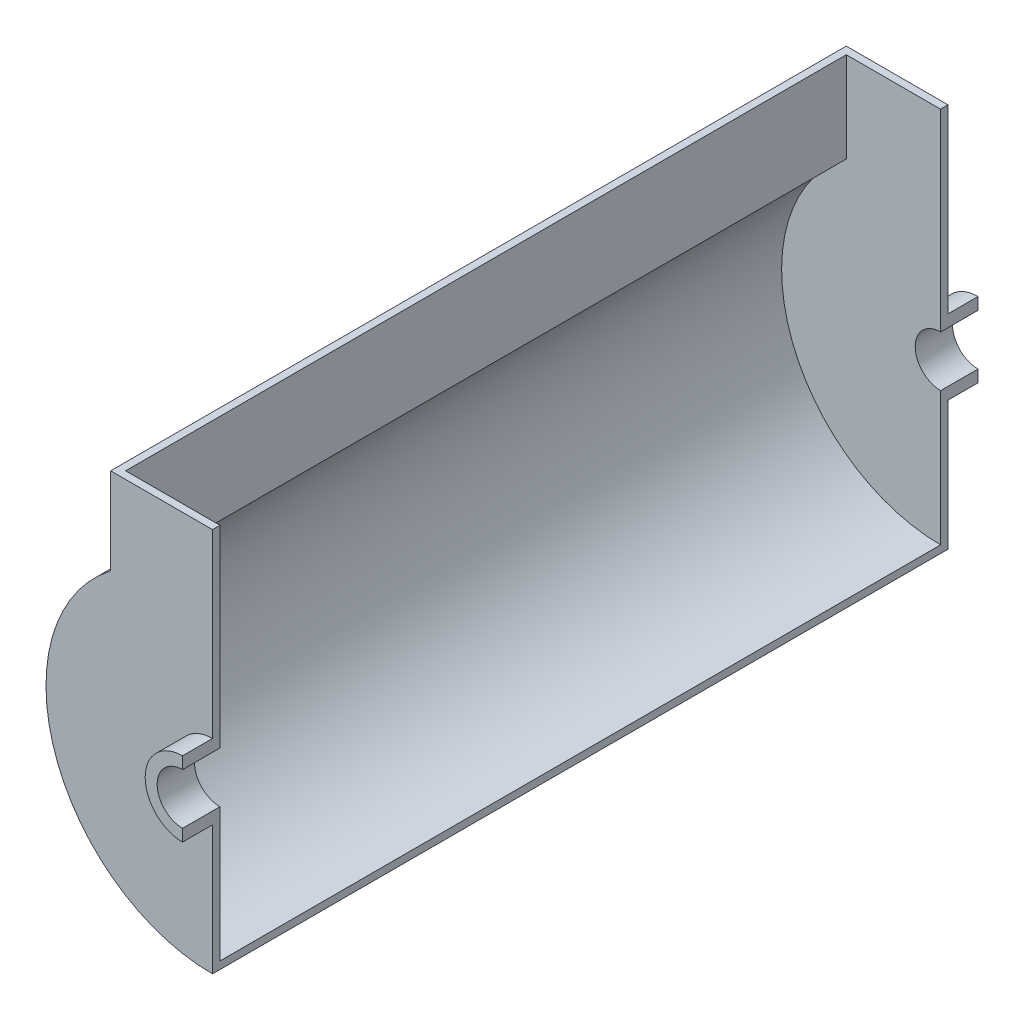
ISO-10303-21;
HEADER;
FILE_DESCRIPTION(('STEP AP214'),'2;1');
FILE_NAME('part.step','',(''),(''),'','','');
FILE_SCHEMA(('AUTOMOTIVE_DESIGN { 1 0 10303 214 1 1 1 1 }'));
ENDSEC;
DATA;
#1=APPLICATION_CONTEXT('core data for automotive mechanical design processes');
#2=APPLICATION_PROTOCOL_DEFINITION('international standard','automotive_design',2000,#1);
#3=PRODUCT_CONTEXT('',#1,'mechanical');
#4=PRODUCT('Part','Part','',(#3));
#5=PRODUCT_RELATED_PRODUCT_CATEGORY('part','',(#4));
#6=PRODUCT_DEFINITION_FORMATION('','',#4);
#7=PRODUCT_DEFINITION_CONTEXT('part definition',#1,'design');
#8=PRODUCT_DEFINITION('design','',#6,#7);
#9=PRODUCT_DEFINITION_SHAPE('','',#8);
#10=(LENGTH_UNIT() NAMED_UNIT(*) SI_UNIT(.MILLI.,.METRE.));
#11=(NAMED_UNIT(*) PLANE_ANGLE_UNIT() SI_UNIT($,.RADIAN.));
#12=(NAMED_UNIT(*) SI_UNIT($,.STERADIAN.) SOLID_ANGLE_UNIT());
#13=UNCERTAINTY_MEASURE_WITH_UNIT(LENGTH_MEASURE(1.E-05),#10,'distance_accuracy_value','');
#14=(GEOMETRIC_REPRESENTATION_CONTEXT(3) GLOBAL_UNCERTAINTY_ASSIGNED_CONTEXT((#13)) GLOBAL_UNIT_ASSIGNED_CONTEXT((#10,
#11,#12)) REPRESENTATION_CONTEXT('',''));
#15=CARTESIAN_POINT('',(0.,0.,0.));
#16=DIRECTION('',(0.,0.,1.));
#17=DIRECTION('',(1.,0.,0.));
#18=AXIS2_PLACEMENT_3D('',#15,#16,#17);
#19=CARTESIAN_POINT('',(0.,0.,-5.));
#20=DIRECTION('',(0.,0.,1.));
#21=DIRECTION('',(1.,0.,0.));
#22=AXIS2_PLACEMENT_3D('',#19,#20,#21);
#23=PLANE('',#22);
#24=CARTESIAN_POINT('',(0.,0.,-5.));
#25=DIRECTION('',(0.,0.,1.));
#26=DIRECTION('',(-1.,0.,0.));
#27=AXIS2_PLACEMENT_3D('',#24,#25,#26);
#28=CIRCLE('',#27,106.338317305831);
#29=CARTESIAN_POINT('',(-63.0935796315746,85.5981187685207,-5.));
#30=VERTEX_POINT('',#29);
#31=CARTESIAN_POINT('',(0.,-106.338317305831,-5.));
#32=VERTEX_POINT('',#31);
#33=EDGE_CURVE('E195',#30,#32,#28,.T.);
#34=ORIENTED_EDGE('',*,*,#33,.F.);
#35=DIRECTION('',(0.,-1.,0.));
#36=VECTOR('',#35,1.);
#37=CARTESIAN_POINT('',(-63.0935796315746,146.014758250682,-5.));
#38=LINE('',#37,#36);
#39=CARTESIAN_POINT('',(-63.0935796315746,146.014758250682,-5.));
#40=VERTEX_POINT('',#39);
#41=EDGE_CURVE('E52',#40,#30,#38,.T.);
#42=ORIENTED_EDGE('',*,*,#41,.F.);
#43=DIRECTION('',(-1.,0.,0.));
#44=VECTOR('',#43,1.);
#45=CARTESIAN_POINT('',(0.,146.014758250682,-5.));
#46=LINE('',#45,#44);
#47=CARTESIAN_POINT('',(0.,146.014758250682,-5.));
#48=VERTEX_POINT('',#47);
#49=EDGE_CURVE('E211',#48,#40,#46,.T.);
#50=ORIENTED_EDGE('',*,*,#49,.F.);
#51=DIRECTION('',(0.,1.,0.));
#52=VECTOR('',#51,1.);
#53=CARTESIAN_POINT('',(0.,25.,-5.));
#54=LINE('',#53,#52);
#55=CARTESIAN_POINT('',(0.,17.,-5.));
#56=VERTEX_POINT('',#55);
#57=EDGE_CURVE('E253',#56,#48,#54,.T.);
#58=ORIENTED_EDGE('',*,*,#57,.F.);
#59=CARTESIAN_POINT('',(0.,0.,-5.));
#60=DIRECTION('',(0.,0.,-1.));
#61=DIRECTION('',(1.,0.,0.));
#62=AXIS2_PLACEMENT_3D('',#59,#60,#61);
#63=CIRCLE('',#62,17.);
#64=CARTESIAN_POINT('',(0.,-17.,-5.));
#65=VERTEX_POINT('',#64);
#66=EDGE_CURVE('E250',#65,#56,#63,.T.);
#67=ORIENTED_EDGE('',*,*,#66,.F.);
#68=DIRECTION('',(0.,1.,0.));
#69=VECTOR('',#68,1.);
#70=CARTESIAN_POINT('',(0.,-17.,-5.));
#71=LINE('',#70,#69);
#72=EDGE_CURVE('E58',#32,#65,#71,.T.);
#73=ORIENTED_EDGE('',*,*,#72,.F.);
#74=EDGE_LOOP('',(#34,#42,#50,#58,#67,#73));
#75=FACE_BOUND('',#74,.T.);
#76=ADVANCED_FACE('F35',(#75),#23,.F.);
#77=CARTESIAN_POINT('',(0.,0.,-5.));
#78=DIRECTION('',(0.,0.,1.));
#79=DIRECTION('',(1.,0.,0.));
#80=AXIS2_PLACEMENT_3D('',#77,#78,#79);
#81=CYLINDRICAL_SURFACE('',#80,17.);
#82=DIRECTION('',(0.,0.,1.));
#83=VECTOR('',#82,1.);
#84=CARTESIAN_POINT('',(0.,17.,-5.));
#85=LINE('',#84,#83);
#86=CARTESIAN_POINT('',(0.,17.,20.));
#87=VERTEX_POINT('',#86);
#88=EDGE_CURVE('E39',#56,#87,#85,.T.);
#89=ORIENTED_EDGE('',*,*,#88,.T.);
#90=CARTESIAN_POINT('',(0.,0.,20.));
#91=DIRECTION('',(0.,0.,-1.));
#92=DIRECTION('',(1.,0.,0.));
#93=AXIS2_PLACEMENT_3D('',#90,#91,#92);
#94=CIRCLE('',#93,17.);
#95=CARTESIAN_POINT('',(0.,-17.,20.));
#96=VERTEX_POINT('',#95);
#97=EDGE_CURVE('E233',#96,#87,#94,.T.);
#98=ORIENTED_EDGE('',*,*,#97,.F.);
#99=DIRECTION('',(0.,0.,1.));
#100=VECTOR('',#99,1.);
#101=CARTESIAN_POINT('',(0.,-17.,-5.));
#102=LINE('',#101,#100);
#103=EDGE_CURVE('E11',#65,#96,#102,.T.);
#104=ORIENTED_EDGE('',*,*,#103,.F.);
#105=ORIENTED_EDGE('',*,*,#66,.T.);
#106=EDGE_LOOP('',(#89,#98,#104,#105));
#107=FACE_BOUND('',#106,.T.);
#108=ADVANCED_FACE('F37',(#107),#81,.F.);
#109=CARTESIAN_POINT('',(0.,-17.,-5.));
#110=DIRECTION('',(1.,0.,0.));
#111=DIRECTION('',(0.,0.,-1.));
#112=AXIS2_PLACEMENT_3D('',#109,#110,#111);
#113=PLANE('',#112);
#114=ORIENTED_EDGE('',*,*,#103,.T.);
#115=DIRECTION('',(0.,1.,0.));
#116=VECTOR('',#115,1.);
#117=CARTESIAN_POINT('',(0.,-17.,20.));
#118=LINE('',#117,#116);
#119=CARTESIAN_POINT('',(0.,-25.,20.));
#120=VERTEX_POINT('',#119);
#121=EDGE_CURVE('E247',#120,#96,#118,.T.);
#122=ORIENTED_EDGE('',*,*,#121,.F.);
#123=DIRECTION('',(0.,0.,1.));
#124=VECTOR('',#123,1.);
#125=CARTESIAN_POINT('',(0.,-25.,-5.));
#126=LINE('',#125,#124);
#127=CARTESIAN_POINT('',(0.,-25.,0.));
#128=VERTEX_POINT('',#127);
#129=EDGE_CURVE('E44',#128,#120,#126,.T.);
#130=ORIENTED_EDGE('',*,*,#129,.F.);
#131=DIRECTION('',(0.,1.,0.));
#132=VECTOR('',#131,1.);
#133=CARTESIAN_POINT('',(0.,-25.,0.));
#134=LINE('',#133,#132);
#135=CARTESIAN_POINT('',(0.,-111.338317305831,0.));
#136=VERTEX_POINT('',#135);
#137=EDGE_CURVE('E214',#136,#128,#134,.T.);
#138=ORIENTED_EDGE('',*,*,#137,.F.);
#139=DIRECTION('',(0.,0.,1.));
#140=VECTOR('',#139,1.);
#141=CARTESIAN_POINT('',(0.,-111.338317305831,-5.));
#142=LINE('',#141,#140);
#143=CARTESIAN_POINT('',(0.,-111.338317305831,-492.));
#144=VERTEX_POINT('',#143);
#145=EDGE_CURVE('E231',#144,#136,#142,.T.);
#146=ORIENTED_EDGE('',*,*,#145,.F.);
#147=DIRECTION('',(0.,1.,0.));
#148=VECTOR('',#147,1.);
#149=CARTESIAN_POINT('',(0.,-25.,-492.));
#150=LINE('',#149,#148);
#151=CARTESIAN_POINT('',(0.,-25.,-492.));
#152=VERTEX_POINT('',#151);
#153=EDGE_CURVE('E162',#144,#152,#150,.T.);
#154=ORIENTED_EDGE('',*,*,#153,.T.);
#155=DIRECTION('',(0.,0.,-1.));
#156=VECTOR('',#155,1.);
#157=CARTESIAN_POINT('',(0.,-25.,-487.));
#158=LINE('',#157,#156);
#159=CARTESIAN_POINT('',(0.,-25.,-512.));
#160=VERTEX_POINT('',#159);
#161=EDGE_CURVE('E188',#152,#160,#158,.T.);
#162=ORIENTED_EDGE('',*,*,#161,.T.);
#163=DIRECTION('',(0.,1.,0.));
#164=VECTOR('',#163,1.);
#165=CARTESIAN_POINT('',(0.,-17.,-512.));
#166=LINE('',#165,#164);
#167=CARTESIAN_POINT('',(0.,-17.,-512.));
#168=VERTEX_POINT('',#167);
#169=EDGE_CURVE('E181',#160,#168,#166,.T.);
#170=ORIENTED_EDGE('',*,*,#169,.T.);
#171=DIRECTION('',(0.,0.,-1.));
#172=VECTOR('',#171,1.);
#173=CARTESIAN_POINT('',(0.,-17.,-487.));
#174=LINE('',#173,#172);
#175=CARTESIAN_POINT('',(0.,-17.,-487.));
#176=VERTEX_POINT('',#175);
#177=EDGE_CURVE('E185',#176,#168,#174,.T.);
#178=ORIENTED_EDGE('',*,*,#177,.F.);
#179=DIRECTION('',(0.,1.,0.));
#180=VECTOR('',#179,1.);
#181=CARTESIAN_POINT('',(0.,-17.,-487.));
#182=LINE('',#181,#180);
#183=CARTESIAN_POINT('',(0.,-106.338317305831,-487.));
#184=VERTEX_POINT('',#183);
#185=EDGE_CURVE('E177',#184,#176,#182,.T.);
#186=ORIENTED_EDGE('',*,*,#185,.F.);
#187=DIRECTION('',(0.,0.,1.));
#188=VECTOR('',#187,1.);
#189=CARTESIAN_POINT('',(0.,-106.338317305831,-767.404754593944));
#190=LINE('',#189,#188);
#191=EDGE_CURVE('E198',#184,#32,#190,.T.);
#192=ORIENTED_EDGE('',*,*,#191,.T.);
#193=ORIENTED_EDGE('',*,*,#72,.T.);
#194=EDGE_LOOP('',(#114,#122,#130,#138,#146,#154,#162,#170,#178,#186,#192,#193));
#195=FACE_BOUND('',#194,.T.);
#196=ADVANCED_FACE('F271',(#195),#113,.T.);
#197=CARTESIAN_POINT('',(0.,0.,-5.));
#198=DIRECTION('',(0.,0.,1.));
#199=DIRECTION('',(1.,0.,0.));
#200=AXIS2_PLACEMENT_3D('',#197,#198,#199);
#201=CYLINDRICAL_SURFACE('',#200,25.);
#202=CARTESIAN_POINT('',(0.,0.,0.));
#203=DIRECTION('',(0.,0.,-1.));
#204=DIRECTION('',(1.,0.,0.));
#205=AXIS2_PLACEMENT_3D('',#202,#203,#204);
#206=CIRCLE('',#205,25.);
#207=CARTESIAN_POINT('',(0.,25.,0.));
#208=VERTEX_POINT('',#207);
#209=EDGE_CURVE('E204',#128,#208,#206,.T.);
#210=ORIENTED_EDGE('',*,*,#209,.F.);
#211=ORIENTED_EDGE('',*,*,#129,.T.);
#212=CARTESIAN_POINT('',(0.,0.,20.));
#213=DIRECTION('',(0.,0.,1.));
#214=DIRECTION('',(1.,0.,0.));
#215=AXIS2_PLACEMENT_3D('',#212,#213,#214);
#216=CIRCLE('',#215,25.);
#217=CARTESIAN_POINT('',(0.,25.,20.));
#218=VERTEX_POINT('',#217);
#219=EDGE_CURVE('E244',#218,#120,#216,.T.);
#220=ORIENTED_EDGE('',*,*,#219,.F.);
#221=DIRECTION('',(0.,0.,1.));
#222=VECTOR('',#221,1.);
#223=CARTESIAN_POINT('',(0.,25.,-5.));
#224=LINE('',#223,#222);
#225=EDGE_CURVE('E256',#208,#218,#224,.T.);
#226=ORIENTED_EDGE('',*,*,#225,.F.);
#227=EDGE_LOOP('',(#210,#211,#220,#226));
#228=FACE_BOUND('',#227,.T.);
#229=ADVANCED_FACE('F278',(#228),#201,.T.);
#230=CARTESIAN_POINT('',(0.,25.,-5.));
#231=DIRECTION('',(1.,0.,0.));
#232=DIRECTION('',(0.,0.,-1.));
#233=AXIS2_PLACEMENT_3D('',#230,#231,#232);
#234=PLANE('',#233);
#235=ORIENTED_EDGE('',*,*,#57,.T.);
#236=DIRECTION('',(0.,0.,1.));
#237=VECTOR('',#236,1.);
#238=CARTESIAN_POINT('',(0.,146.014758250682,-5.));
#239=LINE('',#238,#237);
#240=CARTESIAN_POINT('',(0.,146.014758250682,0.));
#241=VERTEX_POINT('',#240);
#242=EDGE_CURVE('E213',#48,#241,#239,.T.);
#243=ORIENTED_EDGE('',*,*,#242,.T.);
#244=DIRECTION('',(0.,1.,0.));
#245=VECTOR('',#244,1.);
#246=CARTESIAN_POINT('',(0.,25.,0.));
#247=LINE('',#246,#245);
#248=EDGE_CURVE('E217',#208,#241,#247,.T.);
#249=ORIENTED_EDGE('',*,*,#248,.F.);
#250=ORIENTED_EDGE('',*,*,#225,.T.);
#251=DIRECTION('',(0.,1.,0.));
#252=VECTOR('',#251,1.);
#253=CARTESIAN_POINT('',(0.,25.,20.));
#254=LINE('',#253,#252);
#255=EDGE_CURVE('E241',#87,#218,#254,.T.);
#256=ORIENTED_EDGE('',*,*,#255,.F.);
#257=ORIENTED_EDGE('',*,*,#88,.F.);
#258=EDGE_LOOP('',(#235,#243,#249,#250,#256,#257));
#259=FACE_BOUND('',#258,.T.);
#260=ADVANCED_FACE('F264',(#259),#234,.T.);
#261=CARTESIAN_POINT('',(0.,0.,20.));
#262=DIRECTION('',(0.,0.,1.));
#263=DIRECTION('',(1.,0.,0.));
#264=AXIS2_PLACEMENT_3D('',#261,#262,#263);
#265=PLANE('',#264);
#266=ORIENTED_EDGE('',*,*,#97,.T.);
#267=ORIENTED_EDGE('',*,*,#255,.T.);
#268=ORIENTED_EDGE('',*,*,#219,.T.);
#269=ORIENTED_EDGE('',*,*,#121,.T.);
#270=EDGE_LOOP('',(#266,#267,#268,#269));
#271=FACE_BOUND('',#270,.T.);
#272=ADVANCED_FACE('F267',(#271),#265,.T.);
#273=CARTESIAN_POINT('',(0.,0.,-5.));
#274=DIRECTION('',(0.,0.,1.));
#275=DIRECTION('',(1.,0.,0.));
#276=AXIS2_PLACEMENT_3D('',#273,#274,#275);
#277=CYLINDRICAL_SURFACE('',#276,111.338317305831);
#278=CARTESIAN_POINT('',(0.,0.,0.));
#279=DIRECTION('',(0.,0.,1.));
#280=DIRECTION('',(1.,0.,0.));
#281=AXIS2_PLACEMENT_3D('',#278,#279,#280);
#282=CIRCLE('',#281,111.338317305831);
#283=CARTESIAN_POINT('',(-68.0935796315746,88.08794079471,0.));
#284=VERTEX_POINT('',#283);
#285=EDGE_CURVE('E226',#284,#136,#282,.T.);
#286=ORIENTED_EDGE('',*,*,#285,.F.);
#287=DIRECTION('',(0.,0.,1.));
#288=VECTOR('',#287,1.);
#289=CARTESIAN_POINT('',(-68.0935796315746,88.08794079471,-5.));
#290=LINE('',#289,#288);
#291=CARTESIAN_POINT('',(-68.0935796315746,88.08794079471,-492.));
#292=VERTEX_POINT('',#291);
#293=EDGE_CURVE('E234',#292,#284,#290,.T.);
#294=ORIENTED_EDGE('',*,*,#293,.F.);
#295=CARTESIAN_POINT('',(0.,0.,-492.));
#296=DIRECTION('',(0.,0.,1.));
#297=DIRECTION('',(1.,0.,0.));
#298=AXIS2_PLACEMENT_3D('',#295,#296,#297);
#299=CIRCLE('',#298,111.338317305831);
#300=EDGE_CURVE('E346',#292,#144,#299,.T.);
#301=ORIENTED_EDGE('',*,*,#300,.T.);
#302=ORIENTED_EDGE('',*,*,#145,.T.);
#303=EDGE_LOOP('',(#286,#294,#301,#302));
#304=FACE_BOUND('',#303,.T.);
#305=ADVANCED_FACE('F294',(#304),#277,.T.);
#306=CARTESIAN_POINT('',(-68.0935796315746,146.014758250682,-5.));
#307=DIRECTION('',(-1.,0.,0.));
#308=DIRECTION('',(0.,0.,1.));
#309=AXIS2_PLACEMENT_3D('',#306,#307,#308);
#310=PLANE('',#309);
#311=DIRECTION('',(0.,-1.,0.));
#312=VECTOR('',#311,1.);
#313=CARTESIAN_POINT('',(-68.0935796315746,146.014758250682,0.));
#314=LINE('',#313,#312);
#315=CARTESIAN_POINT('',(-68.0935796315746,146.014758250682,0.));
#316=VERTEX_POINT('',#315);
#317=EDGE_CURVE('E223',#316,#284,#314,.T.);
#318=ORIENTED_EDGE('',*,*,#317,.F.);
#319=DIRECTION('',(0.,0.,1.));
#320=VECTOR('',#319,1.);
#321=CARTESIAN_POINT('',(-68.0935796315746,146.014758250682,-5.));
#322=LINE('',#321,#320);
#323=CARTESIAN_POINT('',(-68.0935796315746,146.014758250682,-492.));
#324=VERTEX_POINT('',#323);
#325=EDGE_CURVE('E236',#324,#316,#322,.T.);
#326=ORIENTED_EDGE('',*,*,#325,.F.);
#327=DIRECTION('',(0.,-1.,0.));
#328=VECTOR('',#327,1.);
#329=CARTESIAN_POINT('',(-68.0935796315746,146.014758250682,-492.));
#330=LINE('',#329,#328);
#331=EDGE_CURVE('E348',#324,#292,#330,.T.);
#332=ORIENTED_EDGE('',*,*,#331,.T.);
#333=ORIENTED_EDGE('',*,*,#293,.T.);
#334=EDGE_LOOP('',(#318,#326,#332,#333));
#335=FACE_BOUND('',#334,.T.);
#336=ADVANCED_FACE('F297',(#335),#310,.T.);
#337=CARTESIAN_POINT('',(0.,146.014758250682,-5.));
#338=DIRECTION('',(0.,1.,0.));
#339=DIRECTION('',(0.,0.,1.));
#340=AXIS2_PLACEMENT_3D('',#337,#338,#339);
#341=PLANE('',#340);
#342=DIRECTION('',(-1.,0.,0.));
#343=VECTOR('',#342,1.);
#344=CARTESIAN_POINT('',(0.,146.014758250682,0.));
#345=LINE('',#344,#343);
#346=EDGE_CURVE('E220',#241,#316,#345,.T.);
#347=ORIENTED_EDGE('',*,*,#346,.F.);
#348=ORIENTED_EDGE('',*,*,#242,.F.);
#349=ORIENTED_EDGE('',*,*,#49,.T.);
#350=DIRECTION('',(0.,0.,1.));
#351=VECTOR('',#350,1.);
#352=CARTESIAN_POINT('',(-63.0935796315746,146.014758250682,-767.404754593944));
#353=LINE('',#352,#351);
#354=CARTESIAN_POINT('',(-63.0935796315746,146.014758250682,-487.));
#355=VERTEX_POINT('',#354);
#356=EDGE_CURVE('E158',#355,#40,#353,.T.);
#357=ORIENTED_EDGE('',*,*,#356,.F.);
#358=DIRECTION('',(-1.,0.,0.));
#359=VECTOR('',#358,1.);
#360=CARTESIAN_POINT('',(0.,146.014758250682,-487.));
#361=LINE('',#360,#359);
#362=CARTESIAN_POINT('',(0.,146.014758250682,-487.));
#363=VERTEX_POINT('',#362);
#364=EDGE_CURVE('E150',#363,#355,#361,.T.);
#365=ORIENTED_EDGE('',*,*,#364,.F.);
#366=DIRECTION('',(0.,0.,-1.));
#367=VECTOR('',#366,1.);
#368=CARTESIAN_POINT('',(0.,146.014758250682,-487.));
#369=LINE('',#368,#367);
#370=CARTESIAN_POINT('',(0.,146.014758250682,-492.));
#371=VERTEX_POINT('',#370);
#372=EDGE_CURVE('E155',#363,#371,#369,.T.);
#373=ORIENTED_EDGE('',*,*,#372,.T.);
#374=DIRECTION('',(-1.,0.,0.));
#375=VECTOR('',#374,1.);
#376=CARTESIAN_POINT('',(0.,146.014758250682,-492.));
#377=LINE('',#376,#375);
#378=EDGE_CURVE('E362',#371,#324,#377,.T.);
#379=ORIENTED_EDGE('',*,*,#378,.T.);
#380=ORIENTED_EDGE('',*,*,#325,.T.);
#381=EDGE_LOOP('',(#347,#348,#349,#357,#365,#373,#379,#380));
#382=FACE_BOUND('',#381,.T.);
#383=ADVANCED_FACE('F153',(#382),#341,.T.);
#384=CARTESIAN_POINT('',(0.,0.,0.));
#385=DIRECTION('',(0.,0.,1.));
#386=DIRECTION('',(1.,0.,0.));
#387=AXIS2_PLACEMENT_3D('',#384,#385,#386);
#388=PLANE('',#387);
#389=ORIENTED_EDGE('',*,*,#209,.T.);
#390=ORIENTED_EDGE('',*,*,#248,.T.);
#391=ORIENTED_EDGE('',*,*,#346,.T.);
#392=ORIENTED_EDGE('',*,*,#317,.T.);
#393=ORIENTED_EDGE('',*,*,#285,.T.);
#394=ORIENTED_EDGE('',*,*,#137,.T.);
#395=EDGE_LOOP('',(#389,#390,#391,#392,#393,#394));
#396=FACE_BOUND('',#395,.T.);
#397=ADVANCED_FACE('F276',(#396),#388,.T.);
#398=CARTESIAN_POINT('',(-63.0935796315746,146.014758250682,-767.404754593944));
#399=DIRECTION('',(-1.,0.,0.));
#400=DIRECTION('',(0.,-1.,0.));
#401=AXIS2_PLACEMENT_3D('',#398,#399,#400);
#402=PLANE('',#401);
#403=DIRECTION('',(0.,-1.,0.));
#404=VECTOR('',#403,1.);
#405=CARTESIAN_POINT('',(-63.0935796315746,146.014758250682,-487.));
#406=LINE('',#405,#404);
#407=CARTESIAN_POINT('',(-63.0935796315746,85.5981187685207,-487.));
#408=VERTEX_POINT('',#407);
#409=EDGE_CURVE('E205',#355,#408,#406,.T.);
#410=ORIENTED_EDGE('',*,*,#409,.F.);
#411=ORIENTED_EDGE('',*,*,#356,.T.);
#412=ORIENTED_EDGE('',*,*,#41,.T.);
#413=DIRECTION('',(0.,0.,1.));
#414=VECTOR('',#413,1.);
#415=CARTESIAN_POINT('',(-63.0935796315746,85.5981187685207,-767.404754593944));
#416=LINE('',#415,#414);
#417=EDGE_CURVE('E199',#408,#30,#416,.T.);
#418=ORIENTED_EDGE('',*,*,#417,.F.);
#419=EDGE_LOOP('',(#410,#411,#412,#418));
#420=FACE_BOUND('',#419,.T.);
#421=ADVANCED_FACE('F306',(#420),#402,.F.);
#422=CARTESIAN_POINT('',(0.,0.,-767.404754593944));
#423=DIRECTION('',(0.,0.,1.));
#424=DIRECTION('',(1.,0.,0.));
#425=AXIS2_PLACEMENT_3D('',#422,#423,#424);
#426=CYLINDRICAL_SURFACE('',#425,106.338317305831);
#427=CARTESIAN_POINT('',(0.,0.,-487.));
#428=DIRECTION('',(0.,0.,-1.));
#429=DIRECTION('',(-1.,0.,0.));
#430=AXIS2_PLACEMENT_3D('',#427,#428,#429);
#431=CIRCLE('',#430,106.338317305831);
#432=EDGE_CURVE('E201',#408,#184,#431,.F.);
#433=ORIENTED_EDGE('',*,*,#432,.F.);
#434=ORIENTED_EDGE('',*,*,#417,.T.);
#435=ORIENTED_EDGE('',*,*,#33,.T.);
#436=ORIENTED_EDGE('',*,*,#191,.F.);
#437=EDGE_LOOP('',(#433,#434,#435,#436));
#438=FACE_BOUND('',#437,.T.);
#439=ADVANCED_FACE('F309',(#438),#426,.F.);
#440=CARTESIAN_POINT('',(0.,0.,-487.));
#441=DIRECTION('',(0.,0.,-1.));
#442=DIRECTION('',(1.,0.,0.));
#443=AXIS2_PLACEMENT_3D('',#440,#441,#442);
#444=PLANE('',#443);
#445=ORIENTED_EDGE('',*,*,#364,.T.);
#446=ORIENTED_EDGE('',*,*,#409,.T.);
#447=ORIENTED_EDGE('',*,*,#432,.T.);
#448=ORIENTED_EDGE('',*,*,#185,.T.);
#449=CARTESIAN_POINT('',(0.,0.,-487.));
#450=DIRECTION('',(0.,0.,-1.));
#451=DIRECTION('',(1.,0.,0.));
#452=AXIS2_PLACEMENT_3D('',#449,#450,#451);
#453=CIRCLE('',#452,17.);
#454=CARTESIAN_POINT('',(0.,17.,-487.));
#455=VERTEX_POINT('',#454);
#456=EDGE_CURVE('E175',#176,#455,#453,.T.);
#457=ORIENTED_EDGE('',*,*,#456,.T.);
#458=DIRECTION('',(0.,1.,0.));
#459=VECTOR('',#458,1.);
#460=CARTESIAN_POINT('',(0.,25.,-487.));
#461=LINE('',#460,#459);
#462=EDGE_CURVE('E167',#455,#363,#461,.T.);
#463=ORIENTED_EDGE('',*,*,#462,.T.);
#464=EDGE_LOOP('',(#445,#446,#447,#448,#457,#463));
#465=FACE_BOUND('',#464,.T.);
#466=ADVANCED_FACE('F173',(#465),#444,.F.);
#467=CARTESIAN_POINT('',(0.,0.,-487.));
#468=DIRECTION('',(0.,0.,-1.));
#469=DIRECTION('',(1.,0.,0.));
#470=AXIS2_PLACEMENT_3D('',#467,#468,#469);
#471=CYLINDRICAL_SURFACE('',#470,17.);
#472=DIRECTION('',(0.,0.,-1.));
#473=VECTOR('',#472,1.);
#474=CARTESIAN_POINT('',(0.,17.,-487.));
#475=LINE('',#474,#473);
#476=CARTESIAN_POINT('',(0.,17.,-512.));
#477=VERTEX_POINT('',#476);
#478=EDGE_CURVE('E179',#455,#477,#475,.T.);
#479=ORIENTED_EDGE('',*,*,#478,.F.);
#480=ORIENTED_EDGE('',*,*,#456,.F.);
#481=ORIENTED_EDGE('',*,*,#177,.T.);
#482=CARTESIAN_POINT('',(0.,0.,-512.));
#483=DIRECTION('',(0.,0.,-1.));
#484=DIRECTION('',(1.,0.,0.));
#485=AXIS2_PLACEMENT_3D('',#482,#483,#484);
#486=CIRCLE('',#485,17.);
#487=EDGE_CURVE('E171',#168,#477,#486,.T.);
#488=ORIENTED_EDGE('',*,*,#487,.T.);
#489=EDGE_LOOP('',(#479,#480,#481,#488));
#490=FACE_BOUND('',#489,.T.);
#491=ADVANCED_FACE('F314',(#490),#471,.F.);
#492=CARTESIAN_POINT('',(0.,0.,-487.));
#493=DIRECTION('',(0.,0.,-1.));
#494=DIRECTION('',(1.,0.,0.));
#495=AXIS2_PLACEMENT_3D('',#492,#493,#494);
#496=CYLINDRICAL_SURFACE('',#495,25.);
#497=CARTESIAN_POINT('',(0.,0.,-492.));
#498=DIRECTION('',(0.,0.,-1.));
#499=DIRECTION('',(1.,0.,0.));
#500=AXIS2_PLACEMENT_3D('',#497,#498,#499);
#501=CIRCLE('',#500,25.);
#502=CARTESIAN_POINT('',(0.,25.,-492.));
#503=VERTEX_POINT('',#502);
#504=EDGE_CURVE('E337',#152,#503,#501,.T.);
#505=ORIENTED_EDGE('',*,*,#504,.T.);
#506=DIRECTION('',(0.,0.,-1.));
#507=VECTOR('',#506,1.);
#508=CARTESIAN_POINT('',(0.,25.,-487.));
#509=LINE('',#508,#507);
#510=CARTESIAN_POINT('',(0.,25.,-512.));
#511=VERTEX_POINT('',#510);
#512=EDGE_CURVE('E191',#503,#511,#509,.T.);
#513=ORIENTED_EDGE('',*,*,#512,.T.);
#514=CARTESIAN_POINT('',(0.,0.,-512.));
#515=DIRECTION('',(0.,0.,1.));
#516=DIRECTION('',(1.,0.,0.));
#517=AXIS2_PLACEMENT_3D('',#514,#515,#516);
#518=CIRCLE('',#517,25.);
#519=EDGE_CURVE('E343',#511,#160,#518,.T.);
#520=ORIENTED_EDGE('',*,*,#519,.T.);
#521=ORIENTED_EDGE('',*,*,#161,.F.);
#522=EDGE_LOOP('',(#505,#513,#520,#521));
#523=FACE_BOUND('',#522,.T.);
#524=ADVANCED_FACE('F317',(#523),#496,.T.);
#525=CARTESIAN_POINT('',(0.,25.,-487.));
#526=DIRECTION('',(1.,0.,0.));
#527=DIRECTION('',(0.,0.,1.));
#528=AXIS2_PLACEMENT_3D('',#525,#526,#527);
#529=PLANE('',#528);
#530=ORIENTED_EDGE('',*,*,#462,.F.);
#531=ORIENTED_EDGE('',*,*,#478,.T.);
#532=DIRECTION('',(0.,1.,0.));
#533=VECTOR('',#532,1.);
#534=CARTESIAN_POINT('',(0.,25.,-512.));
#535=LINE('',#534,#533);
#536=EDGE_CURVE('E354',#477,#511,#535,.T.);
#537=ORIENTED_EDGE('',*,*,#536,.T.);
#538=ORIENTED_EDGE('',*,*,#512,.F.);
#539=DIRECTION('',(0.,1.,0.));
#540=VECTOR('',#539,1.);
#541=CARTESIAN_POINT('',(0.,25.,-492.));
#542=LINE('',#541,#540);
#543=EDGE_CURVE('E170',#503,#371,#542,.T.);
#544=ORIENTED_EDGE('',*,*,#543,.T.);
#545=ORIENTED_EDGE('',*,*,#372,.F.);
#546=EDGE_LOOP('',(#530,#531,#537,#538,#544,#545));
#547=FACE_BOUND('',#546,.T.);
#548=ADVANCED_FACE('F165',(#547),#529,.T.);
#549=CARTESIAN_POINT('',(0.,0.,-512.));
#550=DIRECTION('',(0.,0.,-1.));
#551=DIRECTION('',(1.,0.,0.));
#552=AXIS2_PLACEMENT_3D('',#549,#550,#551);
#553=PLANE('',#552);
#554=ORIENTED_EDGE('',*,*,#487,.F.);
#555=ORIENTED_EDGE('',*,*,#169,.F.);
#556=ORIENTED_EDGE('',*,*,#519,.F.);
#557=ORIENTED_EDGE('',*,*,#536,.F.);
#558=EDGE_LOOP('',(#554,#555,#556,#557));
#559=FACE_BOUND('',#558,.T.);
#560=ADVANCED_FACE('F321',(#559),#553,.T.);
#561=CARTESIAN_POINT('',(0.,0.,-492.));
#562=DIRECTION('',(0.,0.,-1.));
#563=DIRECTION('',(1.,0.,0.));
#564=AXIS2_PLACEMENT_3D('',#561,#562,#563);
#565=PLANE('',#564);
#566=ORIENTED_EDGE('',*,*,#504,.F.);
#567=ORIENTED_EDGE('',*,*,#153,.F.);
#568=ORIENTED_EDGE('',*,*,#300,.F.);
#569=ORIENTED_EDGE('',*,*,#331,.F.);
#570=ORIENTED_EDGE('',*,*,#378,.F.);
#571=ORIENTED_EDGE('',*,*,#543,.F.);
#572=EDGE_LOOP('',(#566,#567,#568,#569,#570,#571));
#573=FACE_BOUND('',#572,.T.);
#574=ADVANCED_FACE('F329',(#573),#565,.T.);
#575=CLOSED_SHELL('',(#76,#108,#196,#229,#260,#272,#305,#336,#383,#397,#421,#439,#466,#491,#524,
#548,#560,#574));
#576=MANIFOLD_SOLID_BREP('B2',#575);
#577=ADVANCED_BREP_SHAPE_REPRESENTATION('',(#18,#576),#14);
#578=SHAPE_DEFINITION_REPRESENTATION(#9,#577);
ENDSEC;
END-ISO-10303-21;
